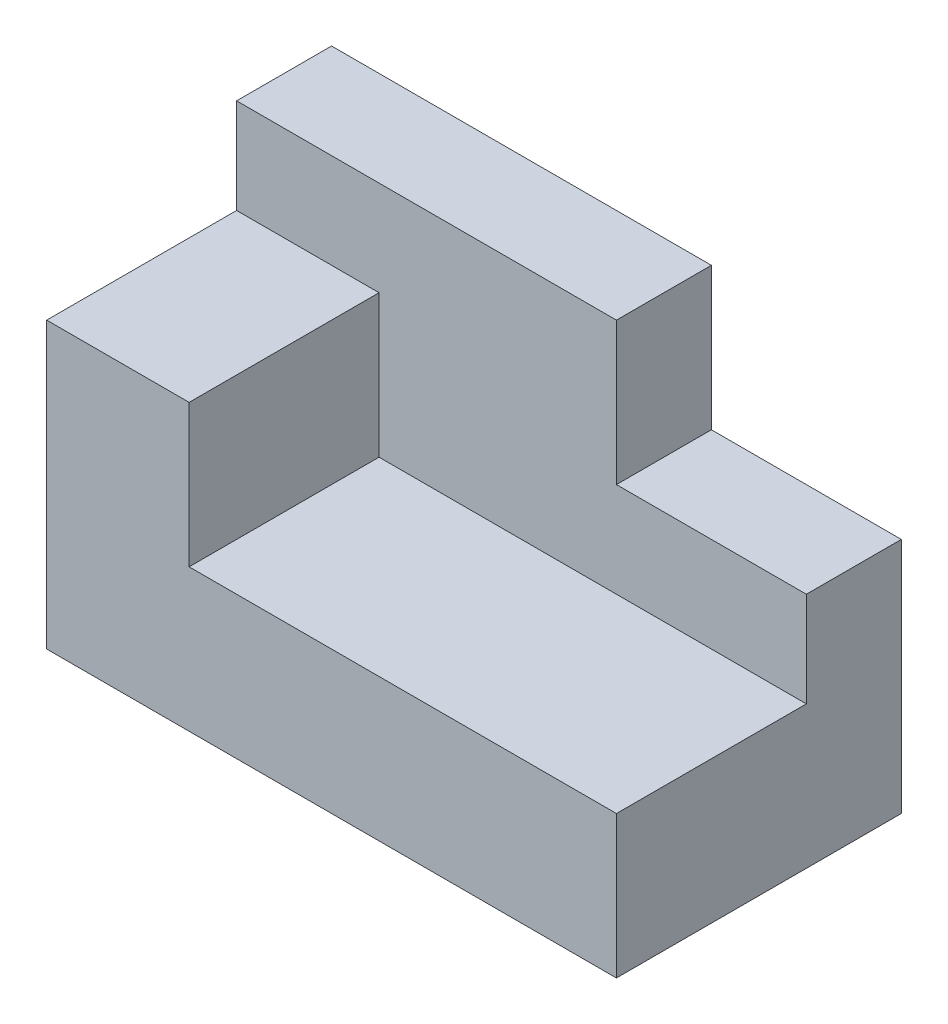
ISO-10303-21;
HEADER;
FILE_DESCRIPTION(('STEP AP214'),'2;1');
FILE_NAME('part.step','',(''),(''),'','','');
FILE_SCHEMA(('AUTOMOTIVE_DESIGN { 1 0 10303 214 1 1 1 1 }'));
ENDSEC;
DATA;
#1=APPLICATION_CONTEXT('core data for automotive mechanical design processes');
#2=APPLICATION_PROTOCOL_DEFINITION('international standard','automotive_design',2000,#1);
#3=PRODUCT_CONTEXT('',#1,'mechanical');
#4=PRODUCT('Part','Part','',(#3));
#5=PRODUCT_RELATED_PRODUCT_CATEGORY('part','',(#4));
#6=PRODUCT_DEFINITION_FORMATION('','',#4);
#7=PRODUCT_DEFINITION_CONTEXT('part definition',#1,'design');
#8=PRODUCT_DEFINITION('design','',#6,#7);
#9=PRODUCT_DEFINITION_SHAPE('','',#8);
#10=(LENGTH_UNIT() NAMED_UNIT(*) SI_UNIT(.MILLI.,.METRE.));
#11=(NAMED_UNIT(*) PLANE_ANGLE_UNIT() SI_UNIT($,.RADIAN.));
#12=(NAMED_UNIT(*) SI_UNIT($,.STERADIAN.) SOLID_ANGLE_UNIT());
#13=UNCERTAINTY_MEASURE_WITH_UNIT(LENGTH_MEASURE(1.E-05),#10,'distance_accuracy_value','');
#14=(GEOMETRIC_REPRESENTATION_CONTEXT(3) GLOBAL_UNCERTAINTY_ASSIGNED_CONTEXT((#13)) GLOBAL_UNIT_ASSIGNED_CONTEXT((#10,
#11,#12)) REPRESENTATION_CONTEXT('',''));
#15=CARTESIAN_POINT('',(0.,0.,0.));
#16=DIRECTION('',(0.,0.,1.));
#17=DIRECTION('',(1.,0.,0.));
#18=AXIS2_PLACEMENT_3D('',#15,#16,#17);
#19=CARTESIAN_POINT('',(0.,0.,30.));
#20=DIRECTION('',(0.,0.,-1.));
#21=DIRECTION('',(-1.,0.,0.));
#22=AXIS2_PLACEMENT_3D('',#19,#20,#21);
#23=PLANE('',#22);
#24=DIRECTION('',(1.,0.,0.));
#25=VECTOR('',#24,1.);
#26=CARTESIAN_POINT('',(0.,30.,30.));
#27=LINE('',#26,#25);
#28=CARTESIAN_POINT('',(0.,30.,30.));
#29=VERTEX_POINT('',#28);
#30=CARTESIAN_POINT('',(15.,30.,30.));
#31=VERTEX_POINT('',#30);
#32=EDGE_CURVE('E48',#29,#31,#27,.T.);
#33=ORIENTED_EDGE('',*,*,#32,.F.);
#34=DIRECTION('',(0.,-1.,0.));
#35=VECTOR('',#34,1.);
#36=CARTESIAN_POINT('',(0.,0.,30.));
#37=LINE('',#36,#35);
#38=CARTESIAN_POINT('',(0.,0.,30.));
#39=VERTEX_POINT('',#38);
#40=EDGE_CURVE('E141',#29,#39,#37,.T.);
#41=ORIENTED_EDGE('',*,*,#40,.T.);
#42=DIRECTION('',(1.,0.,0.));
#43=VECTOR('',#42,1.);
#44=CARTESIAN_POINT('',(60.,0.,30.));
#45=LINE('',#44,#43);
#46=CARTESIAN_POINT('',(60.,0.,30.));
#47=VERTEX_POINT('',#46);
#48=EDGE_CURVE('E134',#39,#47,#45,.T.);
#49=ORIENTED_EDGE('',*,*,#48,.T.);
#50=DIRECTION('',(0.,1.,0.));
#51=VECTOR('',#50,1.);
#52=CARTESIAN_POINT('',(60.,25.,30.));
#53=LINE('',#52,#51);
#54=CARTESIAN_POINT('',(60.,15.,30.));
#55=VERTEX_POINT('',#54);
#56=EDGE_CURVE('E137',#47,#55,#53,.T.);
#57=ORIENTED_EDGE('',*,*,#56,.T.);
#58=DIRECTION('',(1.,0.,0.));
#59=VECTOR('',#58,1.);
#60=CARTESIAN_POINT('',(0.,15.,30.));
#61=LINE('',#60,#59);
#62=CARTESIAN_POINT('',(15.,15.,30.));
#63=VERTEX_POINT('',#62);
#64=EDGE_CURVE('E127',#63,#55,#61,.T.);
#65=ORIENTED_EDGE('',*,*,#64,.F.);
#66=DIRECTION('',(0.,1.,0.));
#67=VECTOR('',#66,1.);
#68=CARTESIAN_POINT('',(15.,15.,30.));
#69=LINE('',#68,#67);
#70=EDGE_CURVE('E126',#63,#31,#69,.T.);
#71=ORIENTED_EDGE('',*,*,#70,.T.);
#72=EDGE_LOOP('',(#33,#41,#49,#57,#65,#71));
#73=FACE_BOUND('',#72,.T.);
#74=ADVANCED_FACE('F33',(#73),#23,.F.);
#75=CARTESIAN_POINT('',(15.,15.,0.));
#76=DIRECTION('',(-1.,0.,0.));
#77=DIRECTION('',(0.,0.,1.));
#78=AXIS2_PLACEMENT_3D('',#75,#76,#77);
#79=PLANE('',#78);
#80=DIRECTION('',(0.,0.,-1.));
#81=VECTOR('',#80,1.);
#82=CARTESIAN_POINT('',(15.,30.,30.));
#83=LINE('',#82,#81);
#84=CARTESIAN_POINT('',(15.,30.,10.));
#85=VERTEX_POINT('',#84);
#86=EDGE_CURVE('E119',#31,#85,#83,.T.);
#87=ORIENTED_EDGE('',*,*,#86,.F.);
#88=ORIENTED_EDGE('',*,*,#70,.F.);
#89=DIRECTION('',(0.,0.,1.));
#90=VECTOR('',#89,1.);
#91=CARTESIAN_POINT('',(15.,15.,0.));
#92=LINE('',#91,#90);
#93=CARTESIAN_POINT('',(15.,15.,10.));
#94=VERTEX_POINT('',#93);
#95=EDGE_CURVE('E56',#94,#63,#92,.T.);
#96=ORIENTED_EDGE('',*,*,#95,.F.);
#97=DIRECTION('',(0.,1.,0.));
#98=VECTOR('',#97,1.);
#99=CARTESIAN_POINT('',(15.,15.,10.));
#100=LINE('',#99,#98);
#101=EDGE_CURVE('E114',#94,#85,#100,.T.);
#102=ORIENTED_EDGE('',*,*,#101,.T.);
#103=EDGE_LOOP('',(#87,#88,#96,#102));
#104=FACE_BOUND('',#103,.T.);
#105=ADVANCED_FACE('F125',(#104),#79,.F.);
#106=CARTESIAN_POINT('',(60.,0.,30.));
#107=DIRECTION('',(0.,1.,0.));
#108=DIRECTION('',(0.,0.,1.));
#109=AXIS2_PLACEMENT_3D('',#106,#107,#108);
#110=PLANE('',#109);
#111=DIRECTION('',(1.,0.,0.));
#112=VECTOR('',#111,1.);
#113=CARTESIAN_POINT('',(60.,0.,0.));
#114=LINE('',#113,#112);
#115=CARTESIAN_POINT('',(0.,0.,0.));
#116=VERTEX_POINT('',#115);
#117=CARTESIAN_POINT('',(60.,0.,0.));
#118=VERTEX_POINT('',#117);
#119=EDGE_CURVE('E144',#116,#118,#114,.T.);
#120=ORIENTED_EDGE('',*,*,#119,.T.);
#121=DIRECTION('',(0.,0.,-1.));
#122=VECTOR('',#121,1.);
#123=CARTESIAN_POINT('',(60.,0.,30.));
#124=LINE('',#123,#122);
#125=EDGE_CURVE('E11',#47,#118,#124,.T.);
#126=ORIENTED_EDGE('',*,*,#125,.F.);
#127=ORIENTED_EDGE('',*,*,#48,.F.);
#128=DIRECTION('',(0.,0.,-1.));
#129=VECTOR('',#128,1.);
#130=CARTESIAN_POINT('',(0.,0.,30.));
#131=LINE('',#130,#129);
#132=EDGE_CURVE('E143',#39,#116,#131,.T.);
#133=ORIENTED_EDGE('',*,*,#132,.T.);
#134=EDGE_LOOP('',(#120,#126,#127,#133));
#135=FACE_BOUND('',#134,.T.);
#136=ADVANCED_FACE('F35',(#135),#110,.F.);
#137=CARTESIAN_POINT('',(60.,25.,30.));
#138=DIRECTION('',(-1.,0.,0.));
#139=DIRECTION('',(0.,0.,1.));
#140=AXIS2_PLACEMENT_3D('',#137,#138,#139);
#141=PLANE('',#140);
#142=DIRECTION('',(0.,0.,-1.));
#143=VECTOR('',#142,1.);
#144=CARTESIAN_POINT('',(60.,25.,30.));
#145=LINE('',#144,#143);
#146=CARTESIAN_POINT('',(60.,25.,10.));
#147=VERTEX_POINT('',#146);
#148=CARTESIAN_POINT('',(60.,25.,0.));
#149=VERTEX_POINT('',#148);
#150=EDGE_CURVE('E41',#147,#149,#145,.T.);
#151=ORIENTED_EDGE('',*,*,#150,.F.);
#152=DIRECTION('',(0.,1.,0.));
#153=VECTOR('',#152,1.);
#154=CARTESIAN_POINT('',(60.,15.,10.));
#155=LINE('',#154,#153);
#156=CARTESIAN_POINT('',(60.,15.,10.));
#157=VERTEX_POINT('',#156);
#158=EDGE_CURVE('E192',#157,#147,#155,.T.);
#159=ORIENTED_EDGE('',*,*,#158,.F.);
#160=DIRECTION('',(0.,0.,-1.));
#161=VECTOR('',#160,1.);
#162=CARTESIAN_POINT('',(60.,15.,10.));
#163=LINE('',#162,#161);
#164=EDGE_CURVE('E197',#55,#157,#163,.T.);
#165=ORIENTED_EDGE('',*,*,#164,.F.);
#166=ORIENTED_EDGE('',*,*,#56,.F.);
#167=ORIENTED_EDGE('',*,*,#125,.T.);
#168=DIRECTION('',(0.,1.,0.));
#169=VECTOR('',#168,1.);
#170=CARTESIAN_POINT('',(60.,25.,0.));
#171=LINE('',#170,#169);
#172=EDGE_CURVE('E147',#118,#149,#171,.T.);
#173=ORIENTED_EDGE('',*,*,#172,.T.);
#174=EDGE_LOOP('',(#151,#159,#165,#166,#167,#173));
#175=FACE_BOUND('',#174,.T.);
#176=ADVANCED_FACE('F177',(#175),#141,.F.);
#177=CARTESIAN_POINT('',(40.,25.,30.));
#178=DIRECTION('',(0.,-1.,0.));
#179=DIRECTION('',(0.,0.,-1.));
#180=AXIS2_PLACEMENT_3D('',#177,#178,#179);
#181=PLANE('',#180);
#182=DIRECTION('',(0.,0.,-1.));
#183=VECTOR('',#182,1.);
#184=CARTESIAN_POINT('',(40.,25.,30.));
#185=LINE('',#184,#183);
#186=CARTESIAN_POINT('',(40.,25.,10.));
#187=VERTEX_POINT('',#186);
#188=CARTESIAN_POINT('',(40.,25.,0.));
#189=VERTEX_POINT('',#188);
#190=EDGE_CURVE('E166',#187,#189,#185,.T.);
#191=ORIENTED_EDGE('',*,*,#190,.F.);
#192=DIRECTION('',(-1.,0.,0.));
#193=VECTOR('',#192,1.);
#194=CARTESIAN_POINT('',(40.,25.,10.));
#195=LINE('',#194,#193);
#196=EDGE_CURVE('E174',#147,#187,#195,.T.);
#197=ORIENTED_EDGE('',*,*,#196,.F.);
#198=ORIENTED_EDGE('',*,*,#150,.T.);
#199=DIRECTION('',(-1.,0.,0.));
#200=VECTOR('',#199,1.);
#201=CARTESIAN_POINT('',(40.,25.,0.));
#202=LINE('',#201,#200);
#203=EDGE_CURVE('E150',#149,#189,#202,.T.);
#204=ORIENTED_EDGE('',*,*,#203,.T.);
#205=EDGE_LOOP('',(#191,#197,#198,#204));
#206=FACE_BOUND('',#205,.T.);
#207=ADVANCED_FACE('F171',(#206),#181,.F.);
#208=CARTESIAN_POINT('',(40.,40.,30.));
#209=DIRECTION('',(-1.,0.,0.));
#210=DIRECTION('',(0.,0.,1.));
#211=AXIS2_PLACEMENT_3D('',#208,#209,#210);
#212=PLANE('',#211);
#213=DIRECTION('',(0.,0.,-1.));
#214=VECTOR('',#213,1.);
#215=CARTESIAN_POINT('',(40.,40.,30.));
#216=LINE('',#215,#214);
#217=CARTESIAN_POINT('',(40.,40.,10.));
#218=VERTEX_POINT('',#217);
#219=CARTESIAN_POINT('',(40.,40.,0.));
#220=VERTEX_POINT('',#219);
#221=EDGE_CURVE('E164',#218,#220,#216,.T.);
#222=ORIENTED_EDGE('',*,*,#221,.F.);
#223=DIRECTION('',(0.,1.,0.));
#224=VECTOR('',#223,1.);
#225=CARTESIAN_POINT('',(40.,15.,10.));
#226=LINE('',#225,#224);
#227=EDGE_CURVE('E129',#187,#218,#226,.T.);
#228=ORIENTED_EDGE('',*,*,#227,.F.);
#229=ORIENTED_EDGE('',*,*,#190,.T.);
#230=DIRECTION('',(0.,1.,0.));
#231=VECTOR('',#230,1.);
#232=CARTESIAN_POINT('',(40.,40.,0.));
#233=LINE('',#232,#231);
#234=EDGE_CURVE('E153',#189,#220,#233,.T.);
#235=ORIENTED_EDGE('',*,*,#234,.T.);
#236=EDGE_LOOP('',(#222,#228,#229,#235));
#237=FACE_BOUND('',#236,.T.);
#238=ADVANCED_FACE('F186',(#237),#212,.F.);
#239=CARTESIAN_POINT('',(0.,40.,30.));
#240=DIRECTION('',(0.,-1.,0.));
#241=DIRECTION('',(1.,0.,0.));
#242=AXIS2_PLACEMENT_3D('',#239,#240,#241);
#243=PLANE('',#242);
#244=DIRECTION('',(0.,0.,-1.));
#245=VECTOR('',#244,1.);
#246=CARTESIAN_POINT('',(0.,40.,30.));
#247=LINE('',#246,#245);
#248=CARTESIAN_POINT('',(0.,40.,10.));
#249=VERTEX_POINT('',#248);
#250=CARTESIAN_POINT('',(0.,40.,0.));
#251=VERTEX_POINT('',#250);
#252=EDGE_CURVE('E162',#249,#251,#247,.T.);
#253=ORIENTED_EDGE('',*,*,#252,.F.);
#254=DIRECTION('',(-1.,0.,0.));
#255=VECTOR('',#254,1.);
#256=CARTESIAN_POINT('',(0.,40.,10.));
#257=LINE('',#256,#255);
#258=EDGE_CURVE('E190',#218,#249,#257,.T.);
#259=ORIENTED_EDGE('',*,*,#258,.F.);
#260=ORIENTED_EDGE('',*,*,#221,.T.);
#261=DIRECTION('',(-1.,0.,0.));
#262=VECTOR('',#261,1.);
#263=CARTESIAN_POINT('',(0.,40.,0.));
#264=LINE('',#263,#262);
#265=EDGE_CURVE('E156',#220,#251,#264,.T.);
#266=ORIENTED_EDGE('',*,*,#265,.T.);
#267=EDGE_LOOP('',(#253,#259,#260,#266));
#268=FACE_BOUND('',#267,.T.);
#269=ADVANCED_FACE('F232',(#268),#243,.F.);
#270=CARTESIAN_POINT('',(0.,0.,30.));
#271=DIRECTION('',(1.,0.,0.));
#272=DIRECTION('',(0.,0.,-1.));
#273=AXIS2_PLACEMENT_3D('',#270,#271,#272);
#274=PLANE('',#273);
#275=DIRECTION('',(0.,0.,1.));
#276=VECTOR('',#275,1.);
#277=CARTESIAN_POINT('',(0.,30.,10.));
#278=LINE('',#277,#276);
#279=CARTESIAN_POINT('',(0.,30.,10.));
#280=VERTEX_POINT('',#279);
#281=EDGE_CURVE('E118',#280,#29,#278,.T.);
#282=ORIENTED_EDGE('',*,*,#281,.F.);
#283=DIRECTION('',(0.,1.,0.));
#284=VECTOR('',#283,1.);
#285=CARTESIAN_POINT('',(0.,30.,10.));
#286=LINE('',#285,#284);
#287=EDGE_CURVE('E116',#280,#249,#286,.T.);
#288=ORIENTED_EDGE('',*,*,#287,.T.);
#289=ORIENTED_EDGE('',*,*,#252,.T.);
#290=DIRECTION('',(0.,-1.,0.));
#291=VECTOR('',#290,1.);
#292=CARTESIAN_POINT('',(0.,0.,0.));
#293=LINE('',#292,#291);
#294=EDGE_CURVE('E138',#251,#116,#293,.T.);
#295=ORIENTED_EDGE('',*,*,#294,.T.);
#296=ORIENTED_EDGE('',*,*,#132,.F.);
#297=ORIENTED_EDGE('',*,*,#40,.F.);
#298=EDGE_LOOP('',(#282,#288,#289,#295,#296,#297));
#299=FACE_BOUND('',#298,.T.);
#300=ADVANCED_FACE('F208',(#299),#274,.F.);
#301=CARTESIAN_POINT('',(0.,0.,0.));
#302=DIRECTION('',(0.,0.,-1.));
#303=DIRECTION('',(-1.,0.,0.));
#304=AXIS2_PLACEMENT_3D('',#301,#302,#303);
#305=PLANE('',#304);
#306=ORIENTED_EDGE('',*,*,#119,.F.);
#307=ORIENTED_EDGE('',*,*,#294,.F.);
#308=ORIENTED_EDGE('',*,*,#265,.F.);
#309=ORIENTED_EDGE('',*,*,#234,.F.);
#310=ORIENTED_EDGE('',*,*,#203,.F.);
#311=ORIENTED_EDGE('',*,*,#172,.F.);
#312=EDGE_LOOP('',(#306,#307,#308,#309,#310,#311));
#313=FACE_BOUND('',#312,.T.);
#314=ADVANCED_FACE('F181',(#313),#305,.T.);
#315=CARTESIAN_POINT('',(0.,15.,10.));
#316=DIRECTION('',(0.,0.,-1.));
#317=DIRECTION('',(-1.,0.,0.));
#318=AXIS2_PLACEMENT_3D('',#315,#316,#317);
#319=PLANE('',#318);
#320=ORIENTED_EDGE('',*,*,#258,.T.);
#321=ORIENTED_EDGE('',*,*,#287,.F.);
#322=DIRECTION('',(-1.,0.,0.));
#323=VECTOR('',#322,1.);
#324=CARTESIAN_POINT('',(15.,30.,10.));
#325=LINE('',#324,#323);
#326=EDGE_CURVE('E111',#85,#280,#325,.T.);
#327=ORIENTED_EDGE('',*,*,#326,.F.);
#328=ORIENTED_EDGE('',*,*,#101,.F.);
#329=DIRECTION('',(-1.,0.,0.));
#330=VECTOR('',#329,1.);
#331=CARTESIAN_POINT('',(0.,15.,10.));
#332=LINE('',#331,#330);
#333=EDGE_CURVE('E191',#157,#94,#332,.T.);
#334=ORIENTED_EDGE('',*,*,#333,.F.);
#335=ORIENTED_EDGE('',*,*,#158,.T.);
#336=ORIENTED_EDGE('',*,*,#196,.T.);
#337=ORIENTED_EDGE('',*,*,#227,.T.);
#338=EDGE_LOOP('',(#320,#321,#327,#328,#334,#335,#336,#337));
#339=FACE_BOUND('',#338,.T.);
#340=ADVANCED_FACE('F112',(#339),#319,.F.);
#341=CARTESIAN_POINT('',(0.,15.,0.));
#342=DIRECTION('',(0.,1.,0.));
#343=DIRECTION('',(-1.,0.,0.));
#344=AXIS2_PLACEMENT_3D('',#341,#342,#343);
#345=PLANE('',#344);
#346=ORIENTED_EDGE('',*,*,#333,.T.);
#347=ORIENTED_EDGE('',*,*,#95,.T.);
#348=ORIENTED_EDGE('',*,*,#64,.T.);
#349=ORIENTED_EDGE('',*,*,#164,.T.);
#350=EDGE_LOOP('',(#346,#347,#348,#349));
#351=FACE_BOUND('',#350,.T.);
#352=ADVANCED_FACE('F212',(#351),#345,.T.);
#353=CARTESIAN_POINT('',(0.,30.,0.));
#354=DIRECTION('',(0.,1.,0.));
#355=DIRECTION('',(0.,0.,1.));
#356=AXIS2_PLACEMENT_3D('',#353,#354,#355);
#357=PLANE('',#356);
#358=ORIENTED_EDGE('',*,*,#86,.T.);
#359=ORIENTED_EDGE('',*,*,#326,.T.);
#360=ORIENTED_EDGE('',*,*,#281,.T.);
#361=ORIENTED_EDGE('',*,*,#32,.T.);
#362=EDGE_LOOP('',(#358,#359,#360,#361));
#363=FACE_BOUND('',#362,.T.);
#364=ADVANCED_FACE('F121',(#363),#357,.T.);
#365=CLOSED_SHELL('',(#74,#105,#136,#176,#207,#238,#269,#300,#314,#340,#352,#364));
#366=MANIFOLD_SOLID_BREP('B2',#365);
#367=ADVANCED_BREP_SHAPE_REPRESENTATION('',(#18,#366),#14);
#368=SHAPE_DEFINITION_REPRESENTATION(#9,#367);
ENDSEC;
END-ISO-10303-21;
